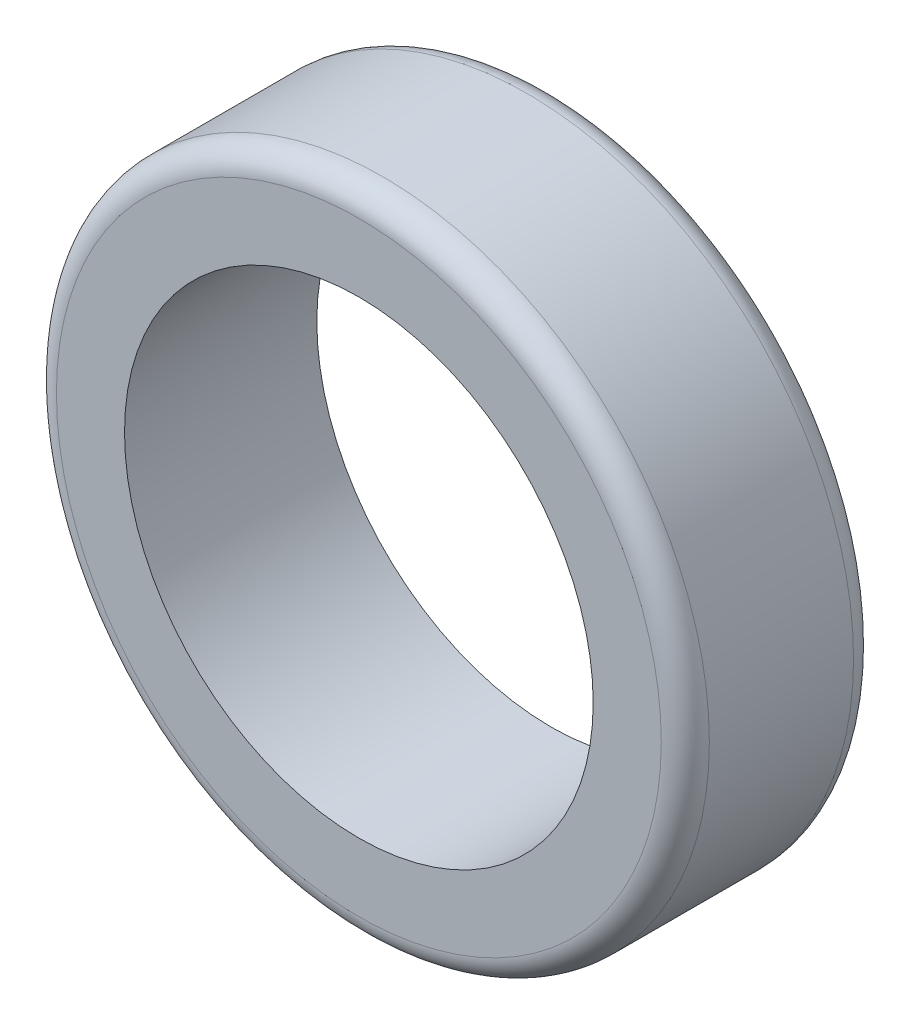
ISO-10303-21;
HEADER;
FILE_DESCRIPTION(('STEP AP214'),'2;1');
FILE_NAME('part.step','',(''),(''),'','','');
FILE_SCHEMA(('AUTOMOTIVE_DESIGN { 1 0 10303 214 1 1 1 1 }'));
ENDSEC;
DATA;
#1=APPLICATION_CONTEXT('core data for automotive mechanical design processes');
#2=APPLICATION_PROTOCOL_DEFINITION('international standard','automotive_design',2000,#1);
#3=PRODUCT_CONTEXT('',#1,'mechanical');
#4=PRODUCT('Part','Part','',(#3));
#5=PRODUCT_RELATED_PRODUCT_CATEGORY('part','',(#4));
#6=PRODUCT_DEFINITION_FORMATION('','',#4);
#7=PRODUCT_DEFINITION_CONTEXT('part definition',#1,'design');
#8=PRODUCT_DEFINITION('design','',#6,#7);
#9=PRODUCT_DEFINITION_SHAPE('','',#8);
#10=(LENGTH_UNIT() NAMED_UNIT(*) SI_UNIT(.MILLI.,.METRE.));
#11=(NAMED_UNIT(*) PLANE_ANGLE_UNIT() SI_UNIT($,.RADIAN.));
#12=(NAMED_UNIT(*) SI_UNIT($,.STERADIAN.) SOLID_ANGLE_UNIT());
#13=UNCERTAINTY_MEASURE_WITH_UNIT(LENGTH_MEASURE(1.E-05),#10,'distance_accuracy_value','');
#14=(GEOMETRIC_REPRESENTATION_CONTEXT(3) GLOBAL_UNCERTAINTY_ASSIGNED_CONTEXT((#13)) GLOBAL_UNIT_ASSIGNED_CONTEXT((#10,
#11,#12)) REPRESENTATION_CONTEXT('',''));
#15=CARTESIAN_POINT('',(0.,0.,0.));
#16=DIRECTION('',(0.,0.,1.));
#17=DIRECTION('',(1.,0.,0.));
#18=AXIS2_PLACEMENT_3D('',#15,#16,#17);
#19=CARTESIAN_POINT('',(0.,0.,10.16));
#20=DIRECTION('',(0.,0.,1.));
#21=DIRECTION('',(1.,0.,0.));
#22=AXIS2_PLACEMENT_3D('',#19,#20,#21);
#23=PLANE('',#22);
#24=CARTESIAN_POINT('',(0.,0.,10.16));
#25=DIRECTION('',(0.,0.,1.));
#26=DIRECTION('',(1.,0.,0.));
#27=AXIS2_PLACEMENT_3D('',#24,#25,#26);
#28=CIRCLE('',#27,15.98);
#29=CARTESIAN_POINT('',(15.98,0.,10.16));
#30=VERTEX_POINT('',#29);
#31=EDGE_CURVE('E45',#30,#30,#28,.T.);
#32=ORIENTED_EDGE('',*,*,#31,.T.);
#33=EDGE_LOOP('',(#32));
#34=FACE_BOUND('',#33,.T.);
#35=CARTESIAN_POINT('',(0.,0.,10.16));
#36=DIRECTION('',(0.,0.,1.));
#37=DIRECTION('',(1.,0.,0.));
#38=AXIS2_PLACEMENT_3D('',#35,#36,#37);
#39=CIRCLE('',#38,12.3825);
#40=CARTESIAN_POINT('',(12.3825,0.,10.16));
#41=VERTEX_POINT('',#40);
#42=EDGE_CURVE('E50',#41,#41,#39,.T.);
#43=ORIENTED_EDGE('',*,*,#42,.F.);
#44=EDGE_LOOP('',(#43));
#45=FACE_BOUND('',#44,.T.);
#46=ADVANCED_FACE('F30',(#34,#45),#23,.T.);
#47=CARTESIAN_POINT('',(0.,0.,0.));
#48=DIRECTION('',(0.,0.,1.));
#49=DIRECTION('',(1.,0.,0.));
#50=AXIS2_PLACEMENT_3D('',#47,#48,#49);
#51=PLANE('',#50);
#52=CARTESIAN_POINT('',(0.,0.,0.));
#53=DIRECTION('',(0.,0.,1.));
#54=DIRECTION('',(1.,0.,0.));
#55=AXIS2_PLACEMENT_3D('',#52,#53,#54);
#56=CIRCLE('',#55,15.98);
#57=CARTESIAN_POINT('',(15.98,0.,0.));
#58=VERTEX_POINT('',#57);
#59=EDGE_CURVE('E10',#58,#58,#56,.F.);
#60=ORIENTED_EDGE('',*,*,#59,.T.);
#61=EDGE_LOOP('',(#60));
#62=FACE_BOUND('',#61,.T.);
#63=CARTESIAN_POINT('',(0.,0.,0.));
#64=DIRECTION('',(0.,0.,1.));
#65=DIRECTION('',(1.,0.,0.));
#66=AXIS2_PLACEMENT_3D('',#63,#64,#65);
#67=CIRCLE('',#66,12.3825);
#68=CARTESIAN_POINT('',(12.3825,0.,0.));
#69=VERTEX_POINT('',#68);
#70=EDGE_CURVE('E51',#69,#69,#67,.T.);
#71=ORIENTED_EDGE('',*,*,#70,.T.);
#72=EDGE_LOOP('',(#71));
#73=FACE_BOUND('',#72,.T.);
#74=ADVANCED_FACE('F61',(#62,#73),#51,.F.);
#75=CARTESIAN_POINT('',(0.,0.,10.16));
#76=DIRECTION('',(0.,0.,-1.));
#77=DIRECTION('',(-1.,0.,0.));
#78=AXIS2_PLACEMENT_3D('',#75,#76,#77);
#79=CYLINDRICAL_SURFACE('',#78,17.25);
#80=CARTESIAN_POINT('',(0.,0.,8.89));
#81=DIRECTION('',(0.,0.,1.));
#82=DIRECTION('',(1.,0.,0.));
#83=AXIS2_PLACEMENT_3D('',#80,#81,#82);
#84=CIRCLE('',#83,17.25);
#85=CARTESIAN_POINT('',(17.25,0.,8.89));
#86=VERTEX_POINT('',#85);
#87=EDGE_CURVE('E37',#86,#86,#84,.F.);
#88=ORIENTED_EDGE('',*,*,#87,.T.);
#89=EDGE_LOOP('',(#88));
#90=FACE_BOUND('',#89,.T.);
#91=CARTESIAN_POINT('',(0.,0.,1.27));
#92=DIRECTION('',(0.,0.,1.));
#93=DIRECTION('',(1.,0.,0.));
#94=AXIS2_PLACEMENT_3D('',#91,#92,#93);
#95=CIRCLE('',#94,17.25);
#96=CARTESIAN_POINT('',(17.25,0.,1.27));
#97=VERTEX_POINT('',#96);
#98=EDGE_CURVE('E41',#97,#97,#95,.T.);
#99=ORIENTED_EDGE('',*,*,#98,.T.);
#100=EDGE_LOOP('',(#99));
#101=FACE_BOUND('',#100,.T.);
#102=ADVANCED_FACE('F67',(#90,#101),#79,.T.);
#103=CARTESIAN_POINT('',(0.,0.,10.16));
#104=DIRECTION('',(0.,0.,-1.));
#105=DIRECTION('',(-1.,0.,0.));
#106=AXIS2_PLACEMENT_3D('',#103,#104,#105);
#107=CYLINDRICAL_SURFACE('',#106,12.3825);
#108=ORIENTED_EDGE('',*,*,#42,.T.);
#109=EDGE_LOOP('',(#108));
#110=FACE_BOUND('',#109,.T.);
#111=ORIENTED_EDGE('',*,*,#70,.F.);
#112=EDGE_LOOP('',(#111));
#113=FACE_BOUND('',#112,.T.);
#114=ADVANCED_FACE('F57',(#110,#113),#107,.F.);
#115=CARTESIAN_POINT('',(0.,0.,8.89));
#116=DIRECTION('',(0.,0.,1.));
#117=DIRECTION('',(1.,0.,0.));
#118=AXIS2_PLACEMENT_3D('',#115,#116,#117);
#119=TOROIDAL_SURFACE('',#118,15.98,1.27);
#120=ORIENTED_EDGE('',*,*,#87,.F.);
#121=EDGE_LOOP('',(#120));
#122=FACE_BOUND('',#121,.T.);
#123=ORIENTED_EDGE('',*,*,#31,.F.);
#124=EDGE_LOOP('',(#123));
#125=FACE_BOUND('',#124,.T.);
#126=ADVANCED_FACE('F72',(#122,#125),#119,.T.);
#127=CARTESIAN_POINT('',(0.,0.,1.27));
#128=DIRECTION('',(0.,0.,1.));
#129=DIRECTION('',(1.,0.,0.));
#130=AXIS2_PLACEMENT_3D('',#127,#128,#129);
#131=TOROIDAL_SURFACE('',#130,15.98,1.27);
#132=ORIENTED_EDGE('',*,*,#59,.F.);
#133=EDGE_LOOP('',(#132));
#134=FACE_BOUND('',#133,.T.);
#135=ORIENTED_EDGE('',*,*,#98,.F.);
#136=EDGE_LOOP('',(#135));
#137=FACE_BOUND('',#136,.T.);
#138=ADVANCED_FACE('F32',(#134,#137),#131,.T.);
#139=CLOSED_SHELL('',(#46,#74,#102,#114,#126,#138));
#140=MANIFOLD_SOLID_BREP('B2',#139);
#141=ADVANCED_BREP_SHAPE_REPRESENTATION('',(#18,#140),#14);
#142=SHAPE_DEFINITION_REPRESENTATION(#9,#141);
ENDSEC;
END-ISO-10303-21;
